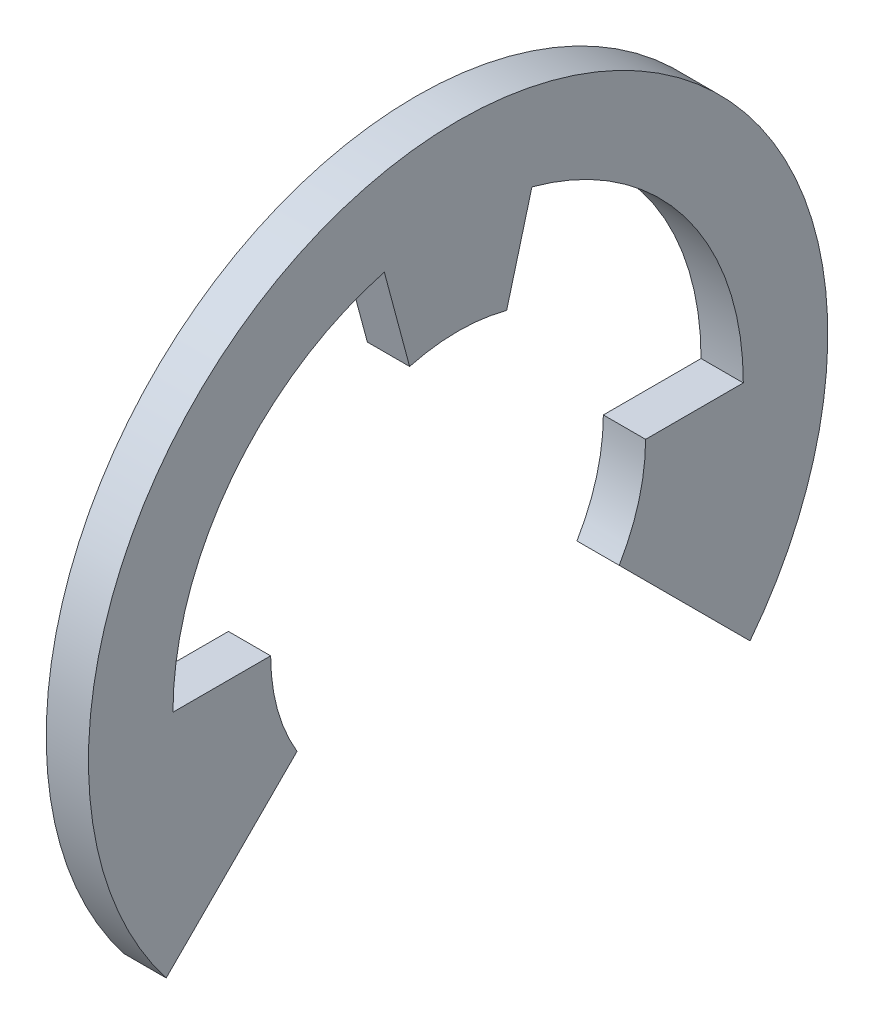
ISO-10303-21;
HEADER;
FILE_DESCRIPTION(('STEP AP214'),'2;1');
FILE_NAME('part.step','',(''),(''),'','','');
FILE_SCHEMA(('AUTOMOTIVE_DESIGN { 1 0 10303 214 1 1 1 1 }'));
ENDSEC;
DATA;
#1=APPLICATION_CONTEXT('core data for automotive mechanical design processes');
#2=APPLICATION_PROTOCOL_DEFINITION('international standard','automotive_design',2000,#1);
#3=PRODUCT_CONTEXT('',#1,'mechanical');
#4=PRODUCT('Part','Part','',(#3));
#5=PRODUCT_RELATED_PRODUCT_CATEGORY('part','',(#4));
#6=PRODUCT_DEFINITION_FORMATION('','',#4);
#7=PRODUCT_DEFINITION_CONTEXT('part definition',#1,'design');
#8=PRODUCT_DEFINITION('design','',#6,#7);
#9=PRODUCT_DEFINITION_SHAPE('','',#8);
#10=(LENGTH_UNIT() NAMED_UNIT(*) SI_UNIT(.MILLI.,.METRE.));
#11=(NAMED_UNIT(*) PLANE_ANGLE_UNIT() SI_UNIT($,.RADIAN.));
#12=(NAMED_UNIT(*) SI_UNIT($,.STERADIAN.) SOLID_ANGLE_UNIT());
#13=UNCERTAINTY_MEASURE_WITH_UNIT(LENGTH_MEASURE(1.E-05),#10,'distance_accuracy_value','');
#14=(GEOMETRIC_REPRESENTATION_CONTEXT(3) GLOBAL_UNCERTAINTY_ASSIGNED_CONTEXT((#13)) GLOBAL_UNIT_ASSIGNED_CONTEXT((#10,
#11,#12)) REPRESENTATION_CONTEXT('',''));
#15=CARTESIAN_POINT('',(0.,0.,0.));
#16=DIRECTION('',(0.,0.,1.));
#17=DIRECTION('',(1.,0.,0.));
#18=AXIS2_PLACEMENT_3D('',#15,#16,#17);
#19=CARTESIAN_POINT('',(0.8,0.,0.));
#20=DIRECTION('',(-1.,0.,0.));
#21=DIRECTION('',(0.,0.,1.));
#22=AXIS2_PLACEMENT_3D('',#19,#20,#21);
#23=CYLINDRICAL_SURFACE('',#22,3.55);
#24=CARTESIAN_POINT('',(0.,0.,0.));
#25=DIRECTION('',(-1.,0.,0.));
#26=DIRECTION('',(0.,0.,-1.));
#27=AXIS2_PLACEMENT_3D('',#24,#25,#26);
#28=CIRCLE('',#27,3.55);
#29=CARTESIAN_POINT('',(0.,-1.8165902124585,3.05));
#30=VERTEX_POINT('',#29);
#31=CARTESIAN_POINT('',(0.,0.,3.55));
#32=VERTEX_POINT('',#31);
#33=EDGE_CURVE('E154',#30,#32,#28,.T.);
#34=ORIENTED_EDGE('',*,*,#33,.T.);
#35=DIRECTION('',(-1.,0.,0.));
#36=VECTOR('',#35,1.);
#37=CARTESIAN_POINT('',(0.8,0.,3.55));
#38=LINE('',#37,#36);
#39=CARTESIAN_POINT('',(0.8,0.,3.55));
#40=VERTEX_POINT('',#39);
#41=EDGE_CURVE('E11',#40,#32,#38,.T.);
#42=ORIENTED_EDGE('',*,*,#41,.F.);
#43=CARTESIAN_POINT('',(0.8,0.,0.));
#44=DIRECTION('',(-1.,0.,0.));
#45=DIRECTION('',(0.,0.,-1.));
#46=AXIS2_PLACEMENT_3D('',#43,#44,#45);
#47=CIRCLE('',#46,3.55);
#48=CARTESIAN_POINT('',(0.8,-1.8165902124585,3.05));
#49=VERTEX_POINT('',#48);
#50=EDGE_CURVE('E176',#49,#40,#47,.T.);
#51=ORIENTED_EDGE('',*,*,#50,.F.);
#52=DIRECTION('',(-1.,0.,0.));
#53=VECTOR('',#52,1.);
#54=CARTESIAN_POINT('',(0.8,-1.8165902124585,3.05));
#55=LINE('',#54,#53);
#56=EDGE_CURVE('E150',#49,#30,#55,.T.);
#57=ORIENTED_EDGE('',*,*,#56,.T.);
#58=EDGE_LOOP('',(#34,#42,#51,#57));
#59=FACE_BOUND('',#58,.T.);
#60=ADVANCED_FACE('F34',(#59),#23,.F.);
#61=CARTESIAN_POINT('',(0.8,0.,3.55));
#62=DIRECTION('',(0.,-1.,0.));
#63=DIRECTION('',(0.,0.,-1.));
#64=AXIS2_PLACEMENT_3D('',#61,#62,#63);
#65=PLANE('',#64);
#66=DIRECTION('',(0.,0.,1.));
#67=VECTOR('',#66,1.);
#68=CARTESIAN_POINT('',(0.,0.,3.55));
#69=LINE('',#68,#67);
#70=CARTESIAN_POINT('',(0.,0.,5.4));
#71=VERTEX_POINT('',#70);
#72=EDGE_CURVE('E157',#32,#71,#69,.T.);
#73=ORIENTED_EDGE('',*,*,#72,.T.);
#74=DIRECTION('',(-1.,0.,0.));
#75=VECTOR('',#74,1.);
#76=CARTESIAN_POINT('',(0.8,0.,5.4));
#77=LINE('',#76,#75);
#78=CARTESIAN_POINT('',(0.8,0.,5.4));
#79=VERTEX_POINT('',#78);
#80=EDGE_CURVE('E42',#79,#71,#77,.T.);
#81=ORIENTED_EDGE('',*,*,#80,.F.);
#82=DIRECTION('',(0.,0.,1.));
#83=VECTOR('',#82,1.);
#84=CARTESIAN_POINT('',(0.8,0.,3.55));
#85=LINE('',#84,#83);
#86=EDGE_CURVE('E105',#40,#79,#85,.T.);
#87=ORIENTED_EDGE('',*,*,#86,.F.);
#88=ORIENTED_EDGE('',*,*,#41,.T.);
#89=EDGE_LOOP('',(#73,#81,#87,#88));
#90=FACE_BOUND('',#89,.T.);
#91=ADVANCED_FACE('F254',(#90),#65,.F.);
#92=CARTESIAN_POINT('',(0.8,0.,0.));
#93=DIRECTION('',(-1.,0.,0.));
#94=DIRECTION('',(0.,0.,1.));
#95=AXIS2_PLACEMENT_3D('',#92,#93,#94);
#96=CYLINDRICAL_SURFACE('',#95,5.4);
#97=CARTESIAN_POINT('',(0.,0.,0.));
#98=DIRECTION('',(-1.,0.,0.));
#99=DIRECTION('',(0.,0.,-1.));
#100=AXIS2_PLACEMENT_3D('',#97,#98,#99);
#101=CIRCLE('',#100,5.4);
#102=CARTESIAN_POINT('',(0.,5.21599946196095,1.39762284355368));
#103=VERTEX_POINT('',#102);
#104=EDGE_CURVE('E159',#71,#103,#101,.T.);
#105=ORIENTED_EDGE('',*,*,#104,.T.);
#106=DIRECTION('',(-1.,0.,0.));
#107=VECTOR('',#106,1.);
#108=CARTESIAN_POINT('',(0.8,5.21599946196095,1.39762284355368));
#109=LINE('',#108,#107);
#110=CARTESIAN_POINT('',(0.8,5.21599946196095,1.39762284355368));
#111=VERTEX_POINT('',#110);
#112=EDGE_CURVE('E195',#111,#103,#109,.T.);
#113=ORIENTED_EDGE('',*,*,#112,.F.);
#114=CARTESIAN_POINT('',(0.8,0.,0.));
#115=DIRECTION('',(-1.,0.,0.));
#116=DIRECTION('',(0.,0.,-1.));
#117=AXIS2_PLACEMENT_3D('',#114,#115,#116);
#118=CIRCLE('',#117,5.4);
#119=EDGE_CURVE('E203',#79,#111,#118,.T.);
#120=ORIENTED_EDGE('',*,*,#119,.F.);
#121=ORIENTED_EDGE('',*,*,#80,.T.);
#122=EDGE_LOOP('',(#105,#113,#120,#121));
#123=FACE_BOUND('',#122,.T.);
#124=ADVANCED_FACE('F201',(#123),#96,.F.);
#125=CARTESIAN_POINT('',(0.8,3.42903668332618,0.918807610113991));
#126=DIRECTION('',(0.,0.258819045102533,-0.965925826289065));
#127=DIRECTION('',(0.,0.965925826289065,0.258819045102533));
#128=AXIS2_PLACEMENT_3D('',#125,#126,#127);
#129=PLANE('',#128);
#130=DIRECTION('',(0.,-0.965925826289065,-0.258819045102533));
#131=VECTOR('',#130,1.);
#132=CARTESIAN_POINT('',(0.,3.42903668332618,0.918807610113991));
#133=LINE('',#132,#131);
#134=CARTESIAN_POINT('',(0.,3.42903668332618,0.918807610113991));
#135=VERTEX_POINT('',#134);
#136=EDGE_CURVE('E161',#103,#135,#133,.T.);
#137=ORIENTED_EDGE('',*,*,#136,.T.);
#138=DIRECTION('',(-1.,0.,0.));
#139=VECTOR('',#138,1.);
#140=CARTESIAN_POINT('',(0.8,3.42903668332618,0.918807610113991));
#141=LINE('',#140,#139);
#142=CARTESIAN_POINT('',(0.8,3.42903668332618,0.918807610113991));
#143=VERTEX_POINT('',#142);
#144=EDGE_CURVE('E192',#143,#135,#141,.T.);
#145=ORIENTED_EDGE('',*,*,#144,.F.);
#146=DIRECTION('',(0.,-0.965925826289065,-0.258819045102533));
#147=VECTOR('',#146,1.);
#148=CARTESIAN_POINT('',(0.8,3.42903668332618,0.918807610113991));
#149=LINE('',#148,#147);
#150=EDGE_CURVE('E221',#111,#143,#149,.T.);
#151=ORIENTED_EDGE('',*,*,#150,.F.);
#152=ORIENTED_EDGE('',*,*,#112,.T.);
#153=EDGE_LOOP('',(#137,#145,#151,#152));
#154=FACE_BOUND('',#153,.T.);
#155=ADVANCED_FACE('F212',(#154),#129,.F.);
#156=CARTESIAN_POINT('',(0.8,0.,0.));
#157=DIRECTION('',(-1.,0.,0.));
#158=DIRECTION('',(0.,0.,1.));
#159=AXIS2_PLACEMENT_3D('',#156,#157,#158);
#160=CYLINDRICAL_SURFACE('',#159,3.55);
#161=CARTESIAN_POINT('',(0.,0.,0.));
#162=DIRECTION('',(-1.,0.,0.));
#163=DIRECTION('',(0.,0.,-1.));
#164=AXIS2_PLACEMENT_3D('',#161,#162,#163);
#165=CIRCLE('',#164,3.55);
#166=CARTESIAN_POINT('',(0.,3.42903668332618,-0.918807610113991));
#167=VERTEX_POINT('',#166);
#168=EDGE_CURVE('E163',#135,#167,#165,.T.);
#169=ORIENTED_EDGE('',*,*,#168,.T.);
#170=DIRECTION('',(-1.,0.,0.));
#171=VECTOR('',#170,1.);
#172=CARTESIAN_POINT('',(0.8,3.42903668332618,-0.918807610113991));
#173=LINE('',#172,#171);
#174=CARTESIAN_POINT('',(0.8,3.42903668332618,-0.918807610113991));
#175=VERTEX_POINT('',#174);
#176=EDGE_CURVE('E189',#175,#167,#173,.T.);
#177=ORIENTED_EDGE('',*,*,#176,.F.);
#178=CARTESIAN_POINT('',(0.8,0.,0.));
#179=DIRECTION('',(-1.,0.,0.));
#180=DIRECTION('',(0.,0.,-1.));
#181=AXIS2_PLACEMENT_3D('',#178,#179,#180);
#182=CIRCLE('',#181,3.55);
#183=EDGE_CURVE('E218',#143,#175,#182,.T.);
#184=ORIENTED_EDGE('',*,*,#183,.F.);
#185=ORIENTED_EDGE('',*,*,#144,.T.);
#186=EDGE_LOOP('',(#169,#177,#184,#185));
#187=FACE_BOUND('',#186,.T.);
#188=ADVANCED_FACE('F216',(#187),#160,.F.);
#189=CARTESIAN_POINT('',(0.8,5.21599946196095,-1.39762284355368));
#190=DIRECTION('',(0.,0.258819045102533,0.965925826289065));
#191=DIRECTION('',(0.,-0.965925826289065,0.258819045102533));
#192=AXIS2_PLACEMENT_3D('',#189,#190,#191);
#193=PLANE('',#192);
#194=DIRECTION('',(0.,0.965925826289065,-0.258819045102533));
#195=VECTOR('',#194,1.);
#196=CARTESIAN_POINT('',(0.,5.21599946196095,-1.39762284355368));
#197=LINE('',#196,#195);
#198=CARTESIAN_POINT('',(0.,5.21599946196095,-1.39762284355368));
#199=VERTEX_POINT('',#198);
#200=EDGE_CURVE('E165',#167,#199,#197,.T.);
#201=ORIENTED_EDGE('',*,*,#200,.T.);
#202=DIRECTION('',(-1.,0.,0.));
#203=VECTOR('',#202,1.);
#204=CARTESIAN_POINT('',(0.8,5.21599946196095,-1.39762284355368));
#205=LINE('',#204,#203);
#206=CARTESIAN_POINT('',(0.8,5.21599946196095,-1.39762284355368));
#207=VERTEX_POINT('',#206);
#208=EDGE_CURVE('E186',#207,#199,#205,.T.);
#209=ORIENTED_EDGE('',*,*,#208,.F.);
#210=DIRECTION('',(0.,0.965925826289065,-0.258819045102533));
#211=VECTOR('',#210,1.);
#212=CARTESIAN_POINT('',(0.8,5.21599946196095,-1.39762284355368));
#213=LINE('',#212,#211);
#214=EDGE_CURVE('E220',#175,#207,#213,.T.);
#215=ORIENTED_EDGE('',*,*,#214,.F.);
#216=ORIENTED_EDGE('',*,*,#176,.T.);
#217=EDGE_LOOP('',(#201,#209,#215,#216));
#218=FACE_BOUND('',#217,.T.);
#219=ADVANCED_FACE('F267',(#218),#193,.F.);
#220=CARTESIAN_POINT('',(0.8,0.,0.));
#221=DIRECTION('',(-1.,0.,0.));
#222=DIRECTION('',(0.,0.,1.));
#223=AXIS2_PLACEMENT_3D('',#220,#221,#222);
#224=CYLINDRICAL_SURFACE('',#223,5.4);
#225=CARTESIAN_POINT('',(0.,0.,0.));
#226=DIRECTION('',(-1.,0.,0.));
#227=DIRECTION('',(0.,0.,-1.));
#228=AXIS2_PLACEMENT_3D('',#225,#226,#227);
#229=CIRCLE('',#228,5.4);
#230=CARTESIAN_POINT('',(0.,0.,-5.4));
#231=VERTEX_POINT('',#230);
#232=EDGE_CURVE('E167',#199,#231,#229,.T.);
#233=ORIENTED_EDGE('',*,*,#232,.T.);
#234=DIRECTION('',(-1.,0.,0.));
#235=VECTOR('',#234,1.);
#236=CARTESIAN_POINT('',(0.8,0.,-5.4));
#237=LINE('',#236,#235);
#238=CARTESIAN_POINT('',(0.8,0.,-5.4));
#239=VERTEX_POINT('',#238);
#240=EDGE_CURVE('E183',#239,#231,#237,.T.);
#241=ORIENTED_EDGE('',*,*,#240,.F.);
#242=CARTESIAN_POINT('',(0.8,0.,0.));
#243=DIRECTION('',(-1.,0.,0.));
#244=DIRECTION('',(0.,0.,-1.));
#245=AXIS2_PLACEMENT_3D('',#242,#243,#244);
#246=CIRCLE('',#245,5.4);
#247=EDGE_CURVE('E223',#207,#239,#246,.T.);
#248=ORIENTED_EDGE('',*,*,#247,.F.);
#249=ORIENTED_EDGE('',*,*,#208,.T.);
#250=EDGE_LOOP('',(#233,#241,#248,#249));
#251=FACE_BOUND('',#250,.T.);
#252=ADVANCED_FACE('F270',(#251),#224,.F.);
#253=CARTESIAN_POINT('',(0.8,0.,-3.55));
#254=DIRECTION('',(0.,-1.,0.));
#255=DIRECTION('',(0.,0.,-1.));
#256=AXIS2_PLACEMENT_3D('',#253,#254,#255);
#257=PLANE('',#256);
#258=DIRECTION('',(0.,0.,1.));
#259=VECTOR('',#258,1.);
#260=CARTESIAN_POINT('',(0.,0.,-3.55));
#261=LINE('',#260,#259);
#262=CARTESIAN_POINT('',(0.,0.,-3.55));
#263=VERTEX_POINT('',#262);
#264=EDGE_CURVE('E169',#231,#263,#261,.T.);
#265=ORIENTED_EDGE('',*,*,#264,.T.);
#266=DIRECTION('',(-1.,0.,0.));
#267=VECTOR('',#266,1.);
#268=CARTESIAN_POINT('',(0.8,0.,-3.55));
#269=LINE('',#268,#267);
#270=CARTESIAN_POINT('',(0.8,0.,-3.55));
#271=VERTEX_POINT('',#270);
#272=EDGE_CURVE('E180',#271,#263,#269,.T.);
#273=ORIENTED_EDGE('',*,*,#272,.F.);
#274=DIRECTION('',(0.,0.,1.));
#275=VECTOR('',#274,1.);
#276=CARTESIAN_POINT('',(0.8,0.,-3.55));
#277=LINE('',#276,#275);
#278=EDGE_CURVE('E229',#239,#271,#277,.T.);
#279=ORIENTED_EDGE('',*,*,#278,.F.);
#280=ORIENTED_EDGE('',*,*,#240,.T.);
#281=EDGE_LOOP('',(#265,#273,#279,#280));
#282=FACE_BOUND('',#281,.T.);
#283=ADVANCED_FACE('F235',(#282),#257,.F.);
#284=CARTESIAN_POINT('',(0.8,0.,0.));
#285=DIRECTION('',(-1.,0.,0.));
#286=DIRECTION('',(0.,0.,1.));
#287=AXIS2_PLACEMENT_3D('',#284,#285,#286);
#288=CYLINDRICAL_SURFACE('',#287,3.55);
#289=CARTESIAN_POINT('',(0.,0.,0.));
#290=DIRECTION('',(-1.,0.,0.));
#291=DIRECTION('',(0.,0.,-1.));
#292=AXIS2_PLACEMENT_3D('',#289,#290,#291);
#293=CIRCLE('',#292,3.55);
#294=CARTESIAN_POINT('',(0.,-1.8165902124585,-3.05));
#295=VERTEX_POINT('',#294);
#296=EDGE_CURVE('E171',#263,#295,#293,.T.);
#297=ORIENTED_EDGE('',*,*,#296,.T.);
#298=DIRECTION('',(-1.,0.,0.));
#299=VECTOR('',#298,1.);
#300=CARTESIAN_POINT('',(0.8,-1.8165902124585,-3.05));
#301=LINE('',#300,#299);
#302=CARTESIAN_POINT('',(0.8,-1.8165902124585,-3.05));
#303=VERTEX_POINT('',#302);
#304=EDGE_CURVE('E145',#303,#295,#301,.T.);
#305=ORIENTED_EDGE('',*,*,#304,.F.);
#306=CARTESIAN_POINT('',(0.8,0.,0.));
#307=DIRECTION('',(-1.,0.,0.));
#308=DIRECTION('',(0.,0.,-1.));
#309=AXIS2_PLACEMENT_3D('',#306,#307,#308);
#310=CIRCLE('',#309,3.55);
#311=EDGE_CURVE('E136',#271,#303,#310,.T.);
#312=ORIENTED_EDGE('',*,*,#311,.F.);
#313=ORIENTED_EDGE('',*,*,#272,.T.);
#314=EDGE_LOOP('',(#297,#305,#312,#313));
#315=FACE_BOUND('',#314,.T.);
#316=ADVANCED_FACE('F239',(#315),#288,.F.);
#317=CARTESIAN_POINT('',(0.8,-1.8165902124585,-3.05));
#318=DIRECTION('',(0.,0.707106781186547,-0.707106781186548));
#319=DIRECTION('',(0.,0.707106781186548,0.707106781186547));
#320=AXIS2_PLACEMENT_3D('',#317,#318,#319);
#321=PLANE('',#320);
#322=DIRECTION('',(0.,-0.707106781186548,-0.707106781186547));
#323=VECTOR('',#322,1.);
#324=CARTESIAN_POINT('',(0.,-1.8165902124585,-3.05));
#325=LINE('',#324,#323);
#326=CARTESIAN_POINT('',(0.,-4.29447368921717,-5.52788347675867));
#327=VERTEX_POINT('',#326);
#328=EDGE_CURVE('E144',#295,#327,#325,.T.);
#329=ORIENTED_EDGE('',*,*,#328,.T.);
#330=DIRECTION('',(-1.,0.,0.));
#331=VECTOR('',#330,1.);
#332=CARTESIAN_POINT('',(0.8,-4.29447368921717,-5.52788347675867));
#333=LINE('',#332,#331);
#334=CARTESIAN_POINT('',(0.8,-4.29447368921717,-5.52788347675867));
#335=VERTEX_POINT('',#334);
#336=EDGE_CURVE('E141',#335,#327,#333,.T.);
#337=ORIENTED_EDGE('',*,*,#336,.F.);
#338=DIRECTION('',(0.,-0.707106781186548,-0.707106781186547));
#339=VECTOR('',#338,1.);
#340=CARTESIAN_POINT('',(0.8,-1.8165902124585,-3.05));
#341=LINE('',#340,#339);
#342=EDGE_CURVE('E130',#303,#335,#341,.T.);
#343=ORIENTED_EDGE('',*,*,#342,.F.);
#344=ORIENTED_EDGE('',*,*,#304,.T.);
#345=EDGE_LOOP('',(#329,#337,#343,#344));
#346=FACE_BOUND('',#345,.T.);
#347=ADVANCED_FACE('F142',(#346),#321,.F.);
#348=CARTESIAN_POINT('',(0.8,0.,0.));
#349=DIRECTION('',(-1.,0.,0.));
#350=DIRECTION('',(0.,0.,1.));
#351=AXIS2_PLACEMENT_3D('',#348,#349,#350);
#352=CYLINDRICAL_SURFACE('',#351,7.);
#353=CARTESIAN_POINT('',(0.,0.,0.));
#354=DIRECTION('',(1.,0.,0.));
#355=DIRECTION('',(0.,0.,-1.));
#356=AXIS2_PLACEMENT_3D('',#353,#354,#355);
#357=CIRCLE('',#356,7.);
#358=CARTESIAN_POINT('',(0.,-4.29447368921717,5.52788347675867));
#359=VERTEX_POINT('',#358);
#360=EDGE_CURVE('E91',#327,#359,#357,.T.);
#361=ORIENTED_EDGE('',*,*,#360,.T.);
#362=DIRECTION('',(-1.,0.,0.));
#363=VECTOR('',#362,1.);
#364=CARTESIAN_POINT('',(0.8,-4.29447368921717,5.52788347675867));
#365=LINE('',#364,#363);
#366=CARTESIAN_POINT('',(0.8,-4.29447368921717,5.52788347675867));
#367=VERTEX_POINT('',#366);
#368=EDGE_CURVE('E146',#367,#359,#365,.T.);
#369=ORIENTED_EDGE('',*,*,#368,.F.);
#370=CARTESIAN_POINT('',(0.8,0.,0.));
#371=DIRECTION('',(1.,0.,0.));
#372=DIRECTION('',(0.,0.,-1.));
#373=AXIS2_PLACEMENT_3D('',#370,#371,#372);
#374=CIRCLE('',#373,7.);
#375=EDGE_CURVE('E134',#335,#367,#374,.T.);
#376=ORIENTED_EDGE('',*,*,#375,.F.);
#377=ORIENTED_EDGE('',*,*,#336,.T.);
#378=EDGE_LOOP('',(#361,#369,#376,#377));
#379=FACE_BOUND('',#378,.T.);
#380=ADVANCED_FACE('F148',(#379),#352,.T.);
#381=CARTESIAN_POINT('',(0.8,-1.8165902124585,3.05));
#382=DIRECTION('',(0.,0.707106781186547,0.707106781186548));
#383=DIRECTION('',(0.,-0.707106781186548,0.707106781186547));
#384=AXIS2_PLACEMENT_3D('',#381,#382,#383);
#385=PLANE('',#384);
#386=DIRECTION('',(0.,0.707106781186548,-0.707106781186547));
#387=VECTOR('',#386,1.);
#388=CARTESIAN_POINT('',(0.,-1.8165902124585,3.05));
#389=LINE('',#388,#387);
#390=EDGE_CURVE('E97',#359,#30,#389,.T.);
#391=ORIENTED_EDGE('',*,*,#390,.T.);
#392=ORIENTED_EDGE('',*,*,#56,.F.);
#393=DIRECTION('',(0.,0.707106781186548,-0.707106781186547));
#394=VECTOR('',#393,1.);
#395=CARTESIAN_POINT('',(0.8,-1.8165902124585,3.05));
#396=LINE('',#395,#394);
#397=EDGE_CURVE('E50',#367,#49,#396,.T.);
#398=ORIENTED_EDGE('',*,*,#397,.F.);
#399=ORIENTED_EDGE('',*,*,#368,.T.);
#400=EDGE_LOOP('',(#391,#392,#398,#399));
#401=FACE_BOUND('',#400,.T.);
#402=ADVANCED_FACE('F243',(#401),#385,.F.);
#403=CARTESIAN_POINT('',(0.8,0.,0.));
#404=DIRECTION('',(1.,0.,0.));
#405=DIRECTION('',(0.,0.,-1.));
#406=AXIS2_PLACEMENT_3D('',#403,#404,#405);
#407=PLANE('',#406);
#408=ORIENTED_EDGE('',*,*,#50,.T.);
#409=ORIENTED_EDGE('',*,*,#86,.T.);
#410=ORIENTED_EDGE('',*,*,#119,.T.);
#411=ORIENTED_EDGE('',*,*,#150,.T.);
#412=ORIENTED_EDGE('',*,*,#183,.T.);
#413=ORIENTED_EDGE('',*,*,#214,.T.);
#414=ORIENTED_EDGE('',*,*,#247,.T.);
#415=ORIENTED_EDGE('',*,*,#278,.T.);
#416=ORIENTED_EDGE('',*,*,#311,.T.);
#417=ORIENTED_EDGE('',*,*,#342,.T.);
#418=ORIENTED_EDGE('',*,*,#375,.T.);
#419=ORIENTED_EDGE('',*,*,#397,.T.);
#420=EDGE_LOOP('',(#408,#409,#410,#411,#412,#413,#414,#415,#416,#417,#418,#419));
#421=FACE_BOUND('',#420,.T.);
#422=ADVANCED_FACE('F132',(#421),#407,.T.);
#423=CARTESIAN_POINT('',(0.,0.,0.));
#424=DIRECTION('',(1.,0.,0.));
#425=DIRECTION('',(0.,0.,-1.));
#426=AXIS2_PLACEMENT_3D('',#423,#424,#425);
#427=PLANE('',#426);
#428=ORIENTED_EDGE('',*,*,#33,.F.);
#429=ORIENTED_EDGE('',*,*,#390,.F.);
#430=ORIENTED_EDGE('',*,*,#360,.F.);
#431=ORIENTED_EDGE('',*,*,#328,.F.);
#432=ORIENTED_EDGE('',*,*,#296,.F.);
#433=ORIENTED_EDGE('',*,*,#264,.F.);
#434=ORIENTED_EDGE('',*,*,#232,.F.);
#435=ORIENTED_EDGE('',*,*,#200,.F.);
#436=ORIENTED_EDGE('',*,*,#168,.F.);
#437=ORIENTED_EDGE('',*,*,#136,.F.);
#438=ORIENTED_EDGE('',*,*,#104,.F.);
#439=ORIENTED_EDGE('',*,*,#72,.F.);
#440=EDGE_LOOP('',(#428,#429,#430,#431,#432,#433,#434,#435,#436,#437,#438,#439));
#441=FACE_BOUND('',#440,.T.);
#442=ADVANCED_FACE('F207',(#441),#427,.F.);
#443=CLOSED_SHELL('',(#60,#91,#124,#155,#188,#219,#252,#283,#316,#347,#380,#402,#422,#442));
#444=MANIFOLD_SOLID_BREP('B2',#443);
#445=ADVANCED_BREP_SHAPE_REPRESENTATION('',(#18,#444),#14);
#446=SHAPE_DEFINITION_REPRESENTATION(#9,#445);
ENDSEC;
END-ISO-10303-21;
